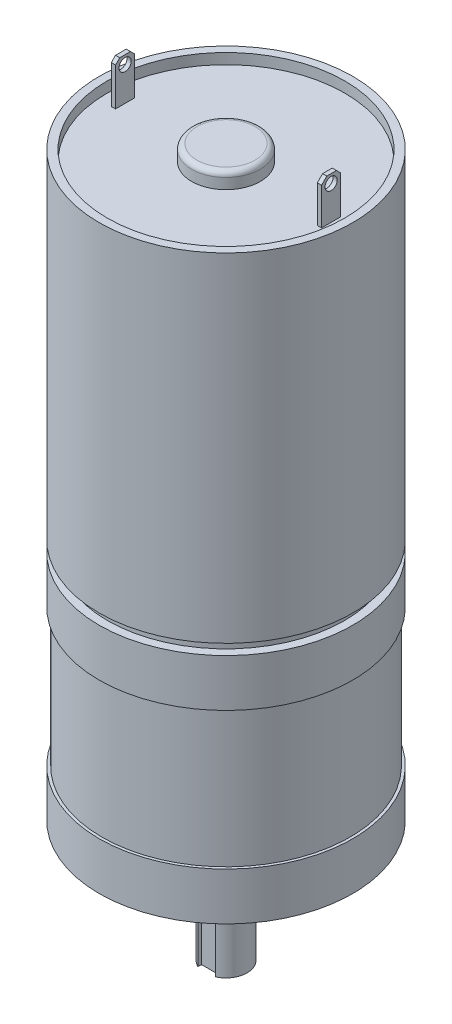
ISO-10303-21;
HEADER;
FILE_DESCRIPTION(('STEP AP214'),'2;1');
FILE_NAME('part.step','',(''),(''),'','','');
FILE_SCHEMA(('AUTOMOTIVE_DESIGN { 1 0 10303 214 1 1 1 1 }'));
ENDSEC;
DATA;
#1=APPLICATION_CONTEXT('core data for automotive mechanical design processes');
#2=APPLICATION_PROTOCOL_DEFINITION('international standard','automotive_design',2000,#1);
#3=PRODUCT_CONTEXT('',#1,'mechanical');
#4=PRODUCT('Part','Part','',(#3));
#5=PRODUCT_RELATED_PRODUCT_CATEGORY('part','',(#4));
#6=PRODUCT_DEFINITION_FORMATION('','',#4);
#7=PRODUCT_DEFINITION_CONTEXT('part definition',#1,'design');
#8=PRODUCT_DEFINITION('design','',#6,#7);
#9=PRODUCT_DEFINITION_SHAPE('','',#8);
#10=(LENGTH_UNIT() NAMED_UNIT(*) SI_UNIT(.MILLI.,.METRE.));
#11=(NAMED_UNIT(*) PLANE_ANGLE_UNIT() SI_UNIT($,.RADIAN.));
#12=(NAMED_UNIT(*) SI_UNIT($,.STERADIAN.) SOLID_ANGLE_UNIT());
#13=UNCERTAINTY_MEASURE_WITH_UNIT(LENGTH_MEASURE(1.E-05),#10,'distance_accuracy_value','');
#14=(GEOMETRIC_REPRESENTATION_CONTEXT(3) GLOBAL_UNCERTAINTY_ASSIGNED_CONTEXT((#13)) GLOBAL_UNIT_ASSIGNED_CONTEXT((#10,
#11,#12)) REPRESENTATION_CONTEXT('',''));
#15=CARTESIAN_POINT('',(0.,0.,0.));
#16=DIRECTION('',(0.,0.,1.));
#17=DIRECTION('',(1.,0.,0.));
#18=AXIS2_PLACEMENT_3D('',#15,#16,#17);
#19=CARTESIAN_POINT('',(0.,26.5,0.));
#20=DIRECTION('',(0.,1.,0.));
#21=DIRECTION('',(0.,0.,1.));
#22=AXIS2_PLACEMENT_3D('',#19,#20,#21);
#23=PLANE('',#22);
#24=DIRECTION('',(1.,0.,0.));
#25=VECTOR('',#24,1.);
#26=CARTESIAN_POINT('',(-9.55183129721211,26.5,-0.906839554497037));
#27=LINE('',#26,#25);
#28=CARTESIAN_POINT('',(-9.95096319405384,26.5,-0.906839554497037));
#29=VERTEX_POINT('',#28);
#30=CARTESIAN_POINT('',(-9.55183129721211,26.5,-0.906839554497037));
#31=VERTEX_POINT('',#30);
#32=EDGE_CURVE('E153',#29,#31,#27,.T.);
#33=ORIENTED_EDGE('',*,*,#32,.T.);
#34=DIRECTION('',(0.,0.,1.));
#35=VECTOR('',#34,1.);
#36=CARTESIAN_POINT('',(-9.55183129721211,26.5,0.906839554497037));
#37=LINE('',#36,#35);
#38=CARTESIAN_POINT('',(-9.55183129721211,26.5,0.906839554497037));
#39=VERTEX_POINT('',#38);
#40=EDGE_CURVE('E166',#31,#39,#37,.T.);
#41=ORIENTED_EDGE('',*,*,#40,.T.);
#42=DIRECTION('',(-1.,0.,0.));
#43=VECTOR('',#42,1.);
#44=CARTESIAN_POINT('',(-9.55183129721211,26.5,0.906839554497037));
#45=LINE('',#44,#43);
#46=CARTESIAN_POINT('',(-9.95096319405384,26.5,0.906839554497037));
#47=VERTEX_POINT('',#46);
#48=EDGE_CURVE('E175',#39,#47,#45,.T.);
#49=ORIENTED_EDGE('',*,*,#48,.T.);
#50=DIRECTION('',(0.,0.,-1.));
#51=VECTOR('',#50,1.);
#52=CARTESIAN_POINT('',(-9.95096319405384,26.5,-0.906839554497037));
#53=LINE('',#52,#51);
#54=EDGE_CURVE('E169',#47,#29,#53,.T.);
#55=ORIENTED_EDGE('',*,*,#54,.T.);
#56=EDGE_LOOP('',(#33,#41,#49,#55));
#57=FACE_BOUND('',#56,.T.);
#58=CARTESIAN_POINT('',(0.,26.5,0.));
#59=DIRECTION('',(0.,1.,0.));
#60=DIRECTION('',(0.,0.,1.));
#61=AXIS2_PLACEMENT_3D('',#58,#59,#60);
#62=CIRCLE('',#61,3.25);
#63=CARTESIAN_POINT('',(0.,26.5,3.25));
#64=VERTEX_POINT('',#63);
#65=EDGE_CURVE('E217',#64,#64,#62,.T.);
#66=ORIENTED_EDGE('',*,*,#65,.F.);
#67=EDGE_LOOP('',(#66));
#68=FACE_BOUND('',#67,.T.);
#69=CARTESIAN_POINT('',(0.,26.5,0.));
#70=DIRECTION('',(0.,1.,0.));
#71=DIRECTION('',(0.,0.,1.));
#72=AXIS2_PLACEMENT_3D('',#69,#70,#71);
#73=CIRCLE('',#72,11.2453658485005);
#74=CARTESIAN_POINT('',(0.,26.5,11.2453658485005));
#75=VERTEX_POINT('',#74);
#76=EDGE_CURVE('E283',#75,#75,#73,.T.);
#77=ORIENTED_EDGE('',*,*,#76,.T.);
#78=EDGE_LOOP('',(#77));
#79=FACE_BOUND('',#78,.T.);
#80=DIRECTION('',(0.,0.,1.));
#81=VECTOR('',#80,1.);
#82=CARTESIAN_POINT('',(9.55183129721211,26.5,0.906839554497037));
#83=LINE('',#82,#81);
#84=CARTESIAN_POINT('',(9.55183129721211,26.5,-0.906839554497037));
#85=VERTEX_POINT('',#84);
#86=CARTESIAN_POINT('',(9.55183129721211,26.5,0.906839554497037));
#87=VERTEX_POINT('',#86);
#88=EDGE_CURVE('E202',#85,#87,#83,.T.);
#89=ORIENTED_EDGE('',*,*,#88,.F.);
#90=DIRECTION('',(-1.,0.,0.));
#91=VECTOR('',#90,1.);
#92=CARTESIAN_POINT('',(9.55183129721211,26.5,-0.906839554497037));
#93=LINE('',#92,#91);
#94=CARTESIAN_POINT('',(9.95096319405384,26.5,-0.906839554497037));
#95=VERTEX_POINT('',#94);
#96=EDGE_CURVE('E192',#95,#85,#93,.T.);
#97=ORIENTED_EDGE('',*,*,#96,.F.);
#98=DIRECTION('',(0.,0.,-1.));
#99=VECTOR('',#98,1.);
#100=CARTESIAN_POINT('',(9.95096319405384,26.5,-0.906839554497037));
#101=LINE('',#100,#99);
#102=CARTESIAN_POINT('',(9.95096319405384,26.5,0.906839554497037));
#103=VERTEX_POINT('',#102);
#104=EDGE_CURVE('E197',#103,#95,#101,.T.);
#105=ORIENTED_EDGE('',*,*,#104,.F.);
#106=DIRECTION('',(1.,0.,0.));
#107=VECTOR('',#106,1.);
#108=CARTESIAN_POINT('',(9.55183129721211,26.5,0.906839554497037));
#109=LINE('',#108,#107);
#110=EDGE_CURVE('E205',#87,#103,#109,.T.);
#111=ORIENTED_EDGE('',*,*,#110,.F.);
#112=EDGE_LOOP('',(#89,#97,#105,#111));
#113=FACE_BOUND('',#112,.T.);
#114=ADVANCED_FACE('F36',(#57,#68,#79,#113),#23,.T.);
#115=CARTESIAN_POINT('',(0.,27.5,0.));
#116=DIRECTION('',(0.,-1.,0.));
#117=DIRECTION('',(0.,0.,-1.));
#118=AXIS2_PLACEMENT_3D('',#115,#116,#117);
#119=CYLINDRICAL_SURFACE('',#118,12.);
#120=CARTESIAN_POINT('',(0.,-5.5,0.));
#121=DIRECTION('',(0.,-1.,0.));
#122=DIRECTION('',(0.,0.,-1.));
#123=AXIS2_PLACEMENT_3D('',#120,#121,#122);
#124=CIRCLE('',#123,12.);
#125=CARTESIAN_POINT('',(0.,-5.5,-12.));
#126=VERTEX_POINT('',#125);
#127=EDGE_CURVE('E274',#126,#126,#124,.T.);
#128=ORIENTED_EDGE('',*,*,#127,.T.);
#129=EDGE_LOOP('',(#128));
#130=FACE_BOUND('',#129,.T.);
#131=CARTESIAN_POINT('',(0.,-10.,0.));
#132=DIRECTION('',(0.,-1.,0.));
#133=DIRECTION('',(0.,0.,-1.));
#134=AXIS2_PLACEMENT_3D('',#131,#132,#133);
#135=CIRCLE('',#134,12.);
#136=CARTESIAN_POINT('',(0.,-10.,-12.));
#137=VERTEX_POINT('',#136);
#138=EDGE_CURVE('E265',#137,#137,#135,.T.);
#139=ORIENTED_EDGE('',*,*,#138,.F.);
#140=EDGE_LOOP('',(#139));
#141=FACE_BOUND('',#140,.T.);
#142=ADVANCED_FACE('F361',(#130,#141),#119,.T.);
#143=CARTESIAN_POINT('',(0.,27.5,0.));
#144=DIRECTION('',(0.,1.,0.));
#145=DIRECTION('',(0.,0.,1.));
#146=AXIS2_PLACEMENT_3D('',#143,#144,#145);
#147=CIRCLE('',#146,12.);
#148=CARTESIAN_POINT('',(0.,27.5,12.));
#149=VERTEX_POINT('',#148);
#150=EDGE_CURVE('E258',#149,#149,#147,.T.);
#151=ORIENTED_EDGE('',*,*,#150,.F.);
#152=EDGE_LOOP('',(#151));
#153=FACE_BOUND('',#152,.T.);
#154=CARTESIAN_POINT('',(0.,-4.5,0.));
#155=DIRECTION('',(0.,-1.,0.));
#156=DIRECTION('',(0.,0.,-1.));
#157=AXIS2_PLACEMENT_3D('',#154,#155,#156);
#158=CIRCLE('',#157,12.);
#159=CARTESIAN_POINT('',(0.,-4.5,-12.));
#160=VERTEX_POINT('',#159);
#161=EDGE_CURVE('E277',#160,#160,#158,.T.);
#162=ORIENTED_EDGE('',*,*,#161,.F.);
#163=EDGE_LOOP('',(#162));
#164=FACE_BOUND('',#163,.T.);
#165=ADVANCED_FACE('F366',(#153,#164),#119,.T.);
#166=CARTESIAN_POINT('',(0.,27.5,0.));
#167=DIRECTION('',(0.,1.,0.));
#168=DIRECTION('',(0.,0.,1.));
#169=AXIS2_PLACEMENT_3D('',#166,#167,#168);
#170=PLANE('',#169);
#171=CARTESIAN_POINT('',(0.,27.5,0.));
#172=DIRECTION('',(0.,1.,0.));
#173=DIRECTION('',(0.,0.,1.));
#174=AXIS2_PLACEMENT_3D('',#171,#172,#173);
#175=CIRCLE('',#174,11.2453658485005);
#176=CARTESIAN_POINT('',(0.,27.5,11.2453658485005));
#177=VERTEX_POINT('',#176);
#178=EDGE_CURVE('E280',#177,#177,#175,.T.);
#179=ORIENTED_EDGE('',*,*,#178,.F.);
#180=EDGE_LOOP('',(#179));
#181=FACE_BOUND('',#180,.T.);
#182=ORIENTED_EDGE('',*,*,#150,.T.);
#183=EDGE_LOOP('',(#182));
#184=FACE_BOUND('',#183,.T.);
#185=ADVANCED_FACE('F378',(#181,#184),#170,.T.);
#186=CARTESIAN_POINT('',(0.,26.5,0.));
#187=DIRECTION('',(0.,1.,0.));
#188=DIRECTION('',(0.,0.,1.));
#189=AXIS2_PLACEMENT_3D('',#186,#187,#188);
#190=CYLINDRICAL_SURFACE('',#189,11.2453658485005);
#191=ORIENTED_EDGE('',*,*,#76,.F.);
#192=EDGE_LOOP('',(#191));
#193=FACE_BOUND('',#192,.T.);
#194=ORIENTED_EDGE('',*,*,#178,.T.);
#195=EDGE_LOOP('',(#194));
#196=FACE_BOUND('',#195,.T.);
#197=ADVANCED_FACE('F374',(#193,#196),#190,.F.);
#198=CARTESIAN_POINT('',(0.,-4.5,0.));
#199=DIRECTION('',(0.,-1.,0.));
#200=DIRECTION('',(0.,0.,-1.));
#201=AXIS2_PLACEMENT_3D('',#198,#199,#200);
#202=PLANE('',#201);
#203=CARTESIAN_POINT('',(0.,-4.5,0.));
#204=DIRECTION('',(0.,-1.,0.));
#205=DIRECTION('',(0.,0.,-1.));
#206=AXIS2_PLACEMENT_3D('',#203,#204,#205);
#207=CIRCLE('',#206,11.226713735415);
#208=CARTESIAN_POINT('',(0.,-4.5,-11.226713735415));
#209=VERTEX_POINT('',#208);
#210=EDGE_CURVE('E271',#209,#209,#207,.T.);
#211=ORIENTED_EDGE('',*,*,#210,.F.);
#212=EDGE_LOOP('',(#211));
#213=FACE_BOUND('',#212,.T.);
#214=ORIENTED_EDGE('',*,*,#161,.T.);
#215=EDGE_LOOP('',(#214));
#216=FACE_BOUND('',#215,.T.);
#217=ADVANCED_FACE('F377',(#213,#216),#202,.T.);
#218=CARTESIAN_POINT('',(0.,-5.5,0.));
#219=DIRECTION('',(0.,-1.,0.));
#220=DIRECTION('',(0.,0.,-1.));
#221=AXIS2_PLACEMENT_3D('',#218,#219,#220);
#222=PLANE('',#221);
#223=CARTESIAN_POINT('',(0.,-5.5,0.));
#224=DIRECTION('',(0.,-1.,0.));
#225=DIRECTION('',(0.,0.,-1.));
#226=AXIS2_PLACEMENT_3D('',#223,#224,#225);
#227=CIRCLE('',#226,11.226713735415);
#228=CARTESIAN_POINT('',(0.,-5.5,-11.226713735415));
#229=VERTEX_POINT('',#228);
#230=EDGE_CURVE('E268',#229,#229,#227,.T.);
#231=ORIENTED_EDGE('',*,*,#230,.T.);
#232=EDGE_LOOP('',(#231));
#233=FACE_BOUND('',#232,.T.);
#234=ORIENTED_EDGE('',*,*,#127,.F.);
#235=EDGE_LOOP('',(#234));
#236=FACE_BOUND('',#235,.T.);
#237=ADVANCED_FACE('F372',(#233,#236),#222,.F.);
#238=CARTESIAN_POINT('',(0.,-4.5,0.));
#239=DIRECTION('',(0.,-1.,0.));
#240=DIRECTION('',(0.,0.,-1.));
#241=AXIS2_PLACEMENT_3D('',#238,#239,#240);
#242=CYLINDRICAL_SURFACE('',#241,11.226713735415);
#243=ORIENTED_EDGE('',*,*,#210,.T.);
#244=EDGE_LOOP('',(#243));
#245=FACE_BOUND('',#244,.T.);
#246=ORIENTED_EDGE('',*,*,#230,.F.);
#247=EDGE_LOOP('',(#246));
#248=FACE_BOUND('',#247,.T.);
#249=ADVANCED_FACE('F497',(#245,#248),#242,.T.);
#250=CARTESIAN_POINT('',(0.,-10.,0.));
#251=DIRECTION('',(0.,-1.,0.));
#252=DIRECTION('',(0.,0.,-1.));
#253=AXIS2_PLACEMENT_3D('',#250,#251,#252);
#254=PLANE('',#253);
#255=CARTESIAN_POINT('',(0.,-10.,0.));
#256=DIRECTION('',(0.,-1.,0.));
#257=DIRECTION('',(0.,0.,-1.));
#258=AXIS2_PLACEMENT_3D('',#255,#256,#257);
#259=CIRCLE('',#258,11.7423883014442);
#260=CARTESIAN_POINT('',(0.,-10.,-11.7423883014442));
#261=VERTEX_POINT('',#260);
#262=EDGE_CURVE('E259',#261,#261,#259,.T.);
#263=ORIENTED_EDGE('',*,*,#262,.F.);
#264=EDGE_LOOP('',(#263));
#265=FACE_BOUND('',#264,.T.);
#266=ORIENTED_EDGE('',*,*,#138,.T.);
#267=EDGE_LOOP('',(#266));
#268=FACE_BOUND('',#267,.T.);
#269=ADVANCED_FACE('F494',(#265,#268),#254,.T.);
#270=CARTESIAN_POINT('',(0.,-23.,0.));
#271=DIRECTION('',(0.,-1.,0.));
#272=DIRECTION('',(0.,0.,-1.));
#273=AXIS2_PLACEMENT_3D('',#270,#271,#272);
#274=PLANE('',#273);
#275=CARTESIAN_POINT('',(0.,-23.,0.));
#276=DIRECTION('',(0.,-1.,0.));
#277=DIRECTION('',(0.,0.,-1.));
#278=AXIS2_PLACEMENT_3D('',#275,#276,#277);
#279=CIRCLE('',#278,11.7423883014442);
#280=CARTESIAN_POINT('',(0.,-23.,-11.7423883014442));
#281=VERTEX_POINT('',#280);
#282=EDGE_CURVE('E255',#281,#281,#279,.T.);
#283=ORIENTED_EDGE('',*,*,#282,.T.);
#284=EDGE_LOOP('',(#283));
#285=FACE_BOUND('',#284,.T.);
#286=CARTESIAN_POINT('',(0.,-23.,0.));
#287=DIRECTION('',(0.,-1.,0.));
#288=DIRECTION('',(0.,0.,-1.));
#289=AXIS2_PLACEMENT_3D('',#286,#287,#288);
#290=CIRCLE('',#289,12.);
#291=CARTESIAN_POINT('',(0.,-23.,-12.));
#292=VERTEX_POINT('',#291);
#293=EDGE_CURVE('E262',#292,#292,#290,.T.);
#294=ORIENTED_EDGE('',*,*,#293,.F.);
#295=EDGE_LOOP('',(#294));
#296=FACE_BOUND('',#295,.T.);
#297=ADVANCED_FACE('F492',(#285,#296),#274,.F.);
#298=CARTESIAN_POINT('',(0.,-10.,0.));
#299=DIRECTION('',(0.,-1.,0.));
#300=DIRECTION('',(0.,0.,-1.));
#301=AXIS2_PLACEMENT_3D('',#298,#299,#300);
#302=CYLINDRICAL_SURFACE('',#301,11.7423883014442);
#303=ORIENTED_EDGE('',*,*,#262,.T.);
#304=EDGE_LOOP('',(#303));
#305=FACE_BOUND('',#304,.T.);
#306=ORIENTED_EDGE('',*,*,#282,.F.);
#307=EDGE_LOOP('',(#306));
#308=FACE_BOUND('',#307,.T.);
#309=ADVANCED_FACE('F385',(#305,#308),#302,.T.);
#310=CARTESIAN_POINT('',(0.,-27.5,0.));
#311=DIRECTION('',(0.,1.,0.));
#312=DIRECTION('',(0.,0.,1.));
#313=AXIS2_PLACEMENT_3D('',#310,#311,#312);
#314=PLANE('',#313);
#315=CARTESIAN_POINT('',(0.,-27.5,0.));
#316=DIRECTION('',(0.,-1.,0.));
#317=DIRECTION('',(0.,0.,-1.));
#318=AXIS2_PLACEMENT_3D('',#315,#316,#317);
#319=CIRCLE('',#318,3.5);
#320=CARTESIAN_POINT('',(0.,-27.5,-3.5));
#321=VERTEX_POINT('',#320);
#322=EDGE_CURVE('E252',#321,#321,#319,.T.);
#323=ORIENTED_EDGE('',*,*,#322,.F.);
#324=EDGE_LOOP('',(#323));
#325=FACE_BOUND('',#324,.T.);
#326=CARTESIAN_POINT('',(0.,-27.5,0.));
#327=DIRECTION('',(0.,1.,0.));
#328=DIRECTION('',(0.,0.,1.));
#329=AXIS2_PLACEMENT_3D('',#326,#327,#328);
#330=CIRCLE('',#329,12.);
#331=CARTESIAN_POINT('',(0.,-27.5,12.));
#332=VERTEX_POINT('',#331);
#333=EDGE_CURVE('E286',#332,#332,#330,.T.);
#334=ORIENTED_EDGE('',*,*,#333,.F.);
#335=EDGE_LOOP('',(#334));
#336=FACE_BOUND('',#335,.T.);
#337=ADVANCED_FACE('F383',(#325,#336),#314,.F.);
#338=ORIENTED_EDGE('',*,*,#293,.T.);
#339=EDGE_LOOP('',(#338));
#340=FACE_BOUND('',#339,.T.);
#341=ORIENTED_EDGE('',*,*,#333,.T.);
#342=EDGE_LOOP('',(#341));
#343=FACE_BOUND('',#342,.T.);
#344=ADVANCED_FACE('F369',(#340,#343),#119,.T.);
#345=CARTESIAN_POINT('',(0.,-30.,0.));
#346=DIRECTION('',(0.,1.,0.));
#347=DIRECTION('',(0.,0.,1.));
#348=AXIS2_PLACEMENT_3D('',#345,#346,#347);
#349=CYLINDRICAL_SURFACE('',#348,3.5);
#350=CARTESIAN_POINT('',(0.,-30.,0.));
#351=DIRECTION('',(0.,-1.,0.));
#352=DIRECTION('',(0.,0.,-1.));
#353=AXIS2_PLACEMENT_3D('',#350,#351,#352);
#354=CIRCLE('',#353,3.5);
#355=CARTESIAN_POINT('',(0.,-30.,-3.5));
#356=VERTEX_POINT('',#355);
#357=EDGE_CURVE('E247',#356,#356,#354,.T.);
#358=ORIENTED_EDGE('',*,*,#357,.F.);
#359=EDGE_LOOP('',(#358));
#360=FACE_BOUND('',#359,.T.);
#361=ORIENTED_EDGE('',*,*,#322,.T.);
#362=EDGE_LOOP('',(#361));
#363=FACE_BOUND('',#362,.T.);
#364=ADVANCED_FACE('F389',(#360,#363),#349,.T.);
#365=CARTESIAN_POINT('',(0.,-30.,0.));
#366=DIRECTION('',(0.,-1.,0.));
#367=DIRECTION('',(0.,0.,-1.));
#368=AXIS2_PLACEMENT_3D('',#365,#366,#367);
#369=PLANE('',#368);
#370=CARTESIAN_POINT('',(0.,-30.,0.));
#371=DIRECTION('',(0.,-1.,0.));
#372=DIRECTION('',(0.,0.,-1.));
#373=AXIS2_PLACEMENT_3D('',#370,#371,#372);
#374=CIRCLE('',#373,2.);
#375=CARTESIAN_POINT('',(0.,-30.,-2.));
#376=VERTEX_POINT('',#375);
#377=EDGE_CURVE('E248',#376,#376,#374,.T.);
#378=ORIENTED_EDGE('',*,*,#377,.F.);
#379=EDGE_LOOP('',(#378));
#380=FACE_BOUND('',#379,.T.);
#381=ORIENTED_EDGE('',*,*,#357,.T.);
#382=EDGE_LOOP('',(#381));
#383=FACE_BOUND('',#382,.T.);
#384=ADVANCED_FACE('F482',(#380,#383),#369,.T.);
#385=CARTESIAN_POINT('',(0.,-39.,0.));
#386=DIRECTION('',(0.,1.,0.));
#387=DIRECTION('',(0.,0.,1.));
#388=AXIS2_PLACEMENT_3D('',#385,#386,#387);
#389=CYLINDRICAL_SURFACE('',#388,2.);
#390=CARTESIAN_POINT('',(0.,-39.,0.));
#391=DIRECTION('',(0.,-1.,0.));
#392=DIRECTION('',(0.,0.,-1.));
#393=AXIS2_PLACEMENT_3D('',#390,#391,#392);
#394=CIRCLE('',#393,2.);
#395=CARTESIAN_POINT('',(-0.84169059918239,-39.,1.81426484705183));
#396=VERTEX_POINT('',#395);
#397=CARTESIAN_POINT('',(0.84169059918239,-39.,1.81426484705183));
#398=VERTEX_POINT('',#397);
#399=EDGE_CURVE('E244',#396,#398,#394,.T.);
#400=ORIENTED_EDGE('',*,*,#399,.F.);
#401=DIRECTION('',(0.,1.,0.));
#402=VECTOR('',#401,1.);
#403=CARTESIAN_POINT('',(-0.84169059918239,-39.,1.81426484705183));
#404=LINE('',#403,#402);
#405=CARTESIAN_POINT('',(-0.84169059918239,-31.,1.81426484705183));
#406=VERTEX_POINT('',#405);
#407=EDGE_CURVE('E241',#396,#406,#404,.T.);
#408=ORIENTED_EDGE('',*,*,#407,.T.);
#409=CARTESIAN_POINT('',(0.,-31.,0.));
#410=DIRECTION('',(0.,-1.,0.));
#411=DIRECTION('',(0.,0.,-1.));
#412=AXIS2_PLACEMENT_3D('',#409,#410,#411);
#413=CIRCLE('',#412,2.);
#414=CARTESIAN_POINT('',(0.84169059918239,-31.,1.81426484705183));
#415=VERTEX_POINT('',#414);
#416=EDGE_CURVE('E294',#415,#406,#413,.T.);
#417=ORIENTED_EDGE('',*,*,#416,.F.);
#418=DIRECTION('',(0.,1.,0.));
#419=VECTOR('',#418,1.);
#420=CARTESIAN_POINT('',(0.84169059918239,-39.,1.81426484705183));
#421=LINE('',#420,#419);
#422=EDGE_CURVE('E236',#415,#398,#421,.F.);
#423=ORIENTED_EDGE('',*,*,#422,.T.);
#424=EDGE_LOOP('',(#400,#408,#417,#423));
#425=FACE_BOUND('',#424,.T.);
#426=ORIENTED_EDGE('',*,*,#377,.T.);
#427=EDGE_LOOP('',(#426));
#428=FACE_BOUND('',#427,.T.);
#429=ADVANCED_FACE('F478',(#425,#428),#389,.T.);
#430=CARTESIAN_POINT('',(0.,-39.,0.));
#431=DIRECTION('',(0.,-1.,0.));
#432=DIRECTION('',(0.,0.,-1.));
#433=AXIS2_PLACEMENT_3D('',#430,#431,#432);
#434=PLANE('',#433);
#435=DIRECTION('',(0.,0.,-1.));
#436=VECTOR('',#435,1.);
#437=CARTESIAN_POINT('',(-0.84169059918239,-39.,0.));
#438=LINE('',#437,#436);
#439=CARTESIAN_POINT('',(-0.84169059918239,-39.,1.47815551840979));
#440=VERTEX_POINT('',#439);
#441=EDGE_CURVE('E251',#396,#440,#438,.T.);
#442=ORIENTED_EDGE('',*,*,#441,.F.);
#443=ORIENTED_EDGE('',*,*,#399,.T.);
#444=DIRECTION('',(0.,0.,1.));
#445=VECTOR('',#444,1.);
#446=CARTESIAN_POINT('',(0.84169059918239,-39.,1.65927550681691));
#447=LINE('',#446,#445);
#448=CARTESIAN_POINT('',(0.84169059918239,-39.,1.47815551840979));
#449=VERTEX_POINT('',#448);
#450=EDGE_CURVE('E220',#449,#398,#447,.T.);
#451=ORIENTED_EDGE('',*,*,#450,.F.);
#452=DIRECTION('',(1.,0.,0.));
#453=VECTOR('',#452,1.);
#454=CARTESIAN_POINT('',(-0.84169059918239,-39.,1.47815551840979));
#455=LINE('',#454,#453);
#456=EDGE_CURVE('E225',#440,#449,#455,.T.);
#457=ORIENTED_EDGE('',*,*,#456,.F.);
#458=EDGE_LOOP('',(#442,#443,#451,#457));
#459=FACE_BOUND('',#458,.T.);
#460=ADVANCED_FACE('F464',(#459),#434,.T.);
#461=CARTESIAN_POINT('',(0.,-31.,0.));
#462=DIRECTION('',(0.,-1.,0.));
#463=DIRECTION('',(0.,0.,-1.));
#464=AXIS2_PLACEMENT_3D('',#461,#462,#463);
#465=PLANE('',#464);
#466=ORIENTED_EDGE('',*,*,#416,.T.);
#467=DIRECTION('',(0.,0.,-1.));
#468=VECTOR('',#467,1.);
#469=CARTESIAN_POINT('',(-0.84169059918239,-31.,1.65927550681691));
#470=LINE('',#469,#468);
#471=CARTESIAN_POINT('',(-0.84169059918239,-31.,1.47815551840979));
#472=VERTEX_POINT('',#471);
#473=EDGE_CURVE('E224',#406,#472,#470,.T.);
#474=ORIENTED_EDGE('',*,*,#473,.T.);
#475=DIRECTION('',(1.,0.,0.));
#476=VECTOR('',#475,1.);
#477=CARTESIAN_POINT('',(-0.84169059918239,-31.,1.47815551840979));
#478=LINE('',#477,#476);
#479=CARTESIAN_POINT('',(0.84169059918239,-31.,1.47815551840979));
#480=VERTEX_POINT('',#479);
#481=EDGE_CURVE('E227',#472,#480,#478,.T.);
#482=ORIENTED_EDGE('',*,*,#481,.T.);
#483=DIRECTION('',(0.,0.,1.));
#484=VECTOR('',#483,1.);
#485=CARTESIAN_POINT('',(0.84169059918239,-31.,1.47815551840979));
#486=LINE('',#485,#484);
#487=EDGE_CURVE('E221',#480,#415,#486,.T.);
#488=ORIENTED_EDGE('',*,*,#487,.T.);
#489=EDGE_LOOP('',(#466,#474,#482,#488));
#490=FACE_BOUND('',#489,.T.);
#491=ADVANCED_FACE('F460',(#490),#465,.T.);
#492=CARTESIAN_POINT('',(-0.84169059918239,-31.,1.65927550681691));
#493=DIRECTION('',(-1.,0.,0.));
#494=DIRECTION('',(0.,0.,1.));
#495=AXIS2_PLACEMENT_3D('',#492,#493,#494);
#496=PLANE('',#495);
#497=ORIENTED_EDGE('',*,*,#441,.T.);
#498=DIRECTION('',(0.,-1.,0.));
#499=VECTOR('',#498,1.);
#500=CARTESIAN_POINT('',(-0.84169059918239,-31.,1.47815551840979));
#501=LINE('',#500,#499);
#502=EDGE_CURVE('E230',#472,#440,#501,.T.);
#503=ORIENTED_EDGE('',*,*,#502,.F.);
#504=ORIENTED_EDGE('',*,*,#473,.F.);
#505=ORIENTED_EDGE('',*,*,#407,.F.);
#506=EDGE_LOOP('',(#497,#503,#504,#505));
#507=FACE_BOUND('',#506,.T.);
#508=ADVANCED_FACE('F463',(#507),#496,.F.);
#509=CARTESIAN_POINT('',(0.84169059918239,-31.,1.65927550681691));
#510=DIRECTION('',(1.,0.,0.));
#511=DIRECTION('',(0.,0.,-1.));
#512=AXIS2_PLACEMENT_3D('',#509,#510,#511);
#513=PLANE('',#512);
#514=ORIENTED_EDGE('',*,*,#487,.F.);
#515=DIRECTION('',(0.,-1.,0.));
#516=VECTOR('',#515,1.);
#517=CARTESIAN_POINT('',(0.84169059918239,-31.,1.47815551840979));
#518=LINE('',#517,#516);
#519=EDGE_CURVE('E233',#480,#449,#518,.T.);
#520=ORIENTED_EDGE('',*,*,#519,.T.);
#521=ORIENTED_EDGE('',*,*,#450,.T.);
#522=ORIENTED_EDGE('',*,*,#422,.F.);
#523=EDGE_LOOP('',(#514,#520,#521,#522));
#524=FACE_BOUND('',#523,.T.);
#525=ADVANCED_FACE('F468',(#524),#513,.F.);
#526=CARTESIAN_POINT('',(-0.84169059918239,-31.,1.47815551840979));
#527=DIRECTION('',(0.,0.,-1.));
#528=DIRECTION('',(-1.,0.,0.));
#529=AXIS2_PLACEMENT_3D('',#526,#527,#528);
#530=PLANE('',#529);
#531=ORIENTED_EDGE('',*,*,#456,.T.);
#532=ORIENTED_EDGE('',*,*,#519,.F.);
#533=ORIENTED_EDGE('',*,*,#481,.F.);
#534=ORIENTED_EDGE('',*,*,#502,.T.);
#535=EDGE_LOOP('',(#531,#532,#533,#534));
#536=FACE_BOUND('',#535,.T.);
#537=ADVANCED_FACE('F458',(#536),#530,.F.);
#538=CARTESIAN_POINT('',(0.,28.,0.));
#539=DIRECTION('',(0.,-1.,0.));
#540=DIRECTION('',(0.,0.,-1.));
#541=AXIS2_PLACEMENT_3D('',#538,#539,#540);
#542=CYLINDRICAL_SURFACE('',#541,3.25);
#543=CARTESIAN_POINT('',(0.,27.5,0.));
#544=DIRECTION('',(0.,1.,0.));
#545=DIRECTION('',(0.,0.,1.));
#546=AXIS2_PLACEMENT_3D('',#543,#544,#545);
#547=CIRCLE('',#546,3.25);
#548=CARTESIAN_POINT('',(0.,27.5,3.25));
#549=VERTEX_POINT('',#548);
#550=EDGE_CURVE('E299',#549,#549,#547,.F.);
#551=ORIENTED_EDGE('',*,*,#550,.T.);
#552=EDGE_LOOP('',(#551));
#553=FACE_BOUND('',#552,.T.);
#554=ORIENTED_EDGE('',*,*,#65,.T.);
#555=EDGE_LOOP('',(#554));
#556=FACE_BOUND('',#555,.T.);
#557=ADVANCED_FACE('F454',(#553,#556),#542,.T.);
#558=CARTESIAN_POINT('',(0.,28.,0.));
#559=DIRECTION('',(0.,1.,0.));
#560=DIRECTION('',(0.,0.,1.));
#561=AXIS2_PLACEMENT_3D('',#558,#559,#560);
#562=PLANE('',#561);
#563=CARTESIAN_POINT('',(0.,28.,0.));
#564=DIRECTION('',(0.,1.,0.));
#565=DIRECTION('',(0.,0.,1.));
#566=AXIS2_PLACEMENT_3D('',#563,#564,#565);
#567=CIRCLE('',#566,2.75);
#568=CARTESIAN_POINT('',(0.,28.,2.75));
#569=VERTEX_POINT('',#568);
#570=EDGE_CURVE('E296',#569,#569,#567,.T.);
#571=ORIENTED_EDGE('',*,*,#570,.T.);
#572=EDGE_LOOP('',(#571));
#573=FACE_BOUND('',#572,.T.);
#574=ADVANCED_FACE('F395',(#573),#562,.T.);
#575=CARTESIAN_POINT('',(0.,27.5,0.));
#576=DIRECTION('',(0.,1.,0.));
#577=DIRECTION('',(0.,0.,1.));
#578=AXIS2_PLACEMENT_3D('',#575,#576,#577);
#579=TOROIDAL_SURFACE('',#578,2.75,0.5);
#580=ORIENTED_EDGE('',*,*,#550,.F.);
#581=EDGE_LOOP('',(#580));
#582=FACE_BOUND('',#581,.T.);
#583=ORIENTED_EDGE('',*,*,#570,.F.);
#584=EDGE_LOOP('',(#583));
#585=FACE_BOUND('',#584,.T.);
#586=ADVANCED_FACE('F391',(#582,#585),#579,.T.);
#587=CARTESIAN_POINT('',(9.55183129721211,30.5,-0.906839554497037));
#588=DIRECTION('',(0.,0.,1.));
#589=DIRECTION('',(1.,0.,0.));
#590=AXIS2_PLACEMENT_3D('',#587,#588,#589);
#591=PLANE('',#590);
#592=DIRECTION('',(0.,-1.,0.));
#593=VECTOR('',#592,1.);
#594=CARTESIAN_POINT('',(9.55183129721211,30.5,-0.906839554497037));
#595=LINE('',#594,#593);
#596=CARTESIAN_POINT('',(9.55183129721211,30.1,-0.906839554497037));
#597=VERTEX_POINT('',#596);
#598=EDGE_CURVE('E215',#597,#85,#595,.T.);
#599=ORIENTED_EDGE('',*,*,#598,.F.);
#600=DIRECTION('',(1.,0.,0.));
#601=VECTOR('',#600,1.);
#602=CARTESIAN_POINT('',(9.55183129721211,30.1,-0.906839554497037));
#603=LINE('',#602,#601);
#604=CARTESIAN_POINT('',(9.95096319405384,30.1,-0.906839554497037));
#605=VERTEX_POINT('',#604);
#606=EDGE_CURVE('E307',#597,#605,#603,.T.);
#607=ORIENTED_EDGE('',*,*,#606,.T.);
#608=DIRECTION('',(0.,-1.,0.));
#609=VECTOR('',#608,1.);
#610=CARTESIAN_POINT('',(9.95096319405384,30.5,-0.906839554497037));
#611=LINE('',#610,#609);
#612=EDGE_CURVE('E199',#605,#95,#611,.T.);
#613=ORIENTED_EDGE('',*,*,#612,.T.);
#614=ORIENTED_EDGE('',*,*,#96,.T.);
#615=EDGE_LOOP('',(#599,#607,#613,#614));
#616=FACE_BOUND('',#615,.T.);
#617=ADVANCED_FACE('F394',(#616),#591,.F.);
#618=CARTESIAN_POINT('',(9.55183129721211,30.5,0.906839554497037));
#619=DIRECTION('',(1.,0.,0.));
#620=DIRECTION('',(0.,0.,-1.));
#621=AXIS2_PLACEMENT_3D('',#618,#619,#620);
#622=PLANE('',#621);
#623=CARTESIAN_POINT('',(9.55183129721211,29.6821239928812,0.));
#624=DIRECTION('',(1.,0.,0.));
#625=DIRECTION('',(0.,0.,-1.));
#626=AXIS2_PLACEMENT_3D('',#623,#624,#625);
#627=CIRCLE('',#626,0.578483289254739);
#628=CARTESIAN_POINT('',(9.55183129721211,29.6821239928812,-0.578483289254739));
#629=VERTEX_POINT('',#628);
#630=EDGE_CURVE('E189',#629,#629,#627,.T.);
#631=ORIENTED_EDGE('',*,*,#630,.T.);
#632=EDGE_LOOP('',(#631));
#633=FACE_BOUND('',#632,.T.);
#634=DIRECTION('',(0.,-1.,0.));
#635=VECTOR('',#634,1.);
#636=CARTESIAN_POINT('',(9.55183129721211,30.5,0.906839554497037));
#637=LINE('',#636,#635);
#638=CARTESIAN_POINT('',(9.55183129721211,30.,0.906839554497037));
#639=VERTEX_POINT('',#638);
#640=EDGE_CURVE('E213',#639,#87,#637,.T.);
#641=ORIENTED_EDGE('',*,*,#640,.F.);
#642=DIRECTION('',(0.,-0.707106781186543,0.707106781186552));
#643=VECTOR('',#642,1.);
#644=CARTESIAN_POINT('',(9.55183129721211,30.5,0.406839554497037));
#645=LINE('',#644,#643);
#646=CARTESIAN_POINT('',(9.55183129721211,30.5,0.406839554497037));
#647=VERTEX_POINT('',#646);
#648=EDGE_CURVE('E319',#639,#647,#645,.F.);
#649=ORIENTED_EDGE('',*,*,#648,.T.);
#650=DIRECTION('',(0.,0.,1.));
#651=VECTOR('',#650,1.);
#652=CARTESIAN_POINT('',(9.55183129721211,30.5,0.906839554497037));
#653=LINE('',#652,#651);
#654=CARTESIAN_POINT('',(9.55183129721211,30.5,-0.506839554497032));
#655=VERTEX_POINT('',#654);
#656=EDGE_CURVE('E193',#655,#647,#653,.T.);
#657=ORIENTED_EDGE('',*,*,#656,.F.);
#658=DIRECTION('',(0.,0.707106781186541,0.707106781186554));
#659=VECTOR('',#658,1.);
#660=CARTESIAN_POINT('',(9.55183129721211,30.5,-0.506839554497032));
#661=LINE('',#660,#659);
#662=EDGE_CURVE('E305',#655,#597,#661,.F.);
#663=ORIENTED_EDGE('',*,*,#662,.T.);
#664=ORIENTED_EDGE('',*,*,#598,.T.);
#665=ORIENTED_EDGE('',*,*,#88,.T.);
#666=EDGE_LOOP('',(#641,#649,#657,#663,#664,#665));
#667=FACE_BOUND('',#666,.T.);
#668=ADVANCED_FACE('F417',(#633,#667),#622,.F.);
#669=CARTESIAN_POINT('',(9.55183129721211,30.5,0.906839554497037));
#670=DIRECTION('',(0.,0.,-1.));
#671=DIRECTION('',(-1.,0.,0.));
#672=AXIS2_PLACEMENT_3D('',#669,#670,#671);
#673=PLANE('',#672);
#674=DIRECTION('',(0.,-1.,0.));
#675=VECTOR('',#674,1.);
#676=CARTESIAN_POINT('',(9.95096319405384,30.5,0.906839554497037));
#677=LINE('',#676,#675);
#678=CARTESIAN_POINT('',(9.95096319405384,30.,0.906839554497037));
#679=VERTEX_POINT('',#678);
#680=EDGE_CURVE('E211',#679,#103,#677,.T.);
#681=ORIENTED_EDGE('',*,*,#680,.F.);
#682=DIRECTION('',(-1.,0.,0.));
#683=VECTOR('',#682,1.);
#684=CARTESIAN_POINT('',(9.55183129721211,30.,0.906839554497037));
#685=LINE('',#684,#683);
#686=EDGE_CURVE('E317',#679,#639,#685,.T.);
#687=ORIENTED_EDGE('',*,*,#686,.T.);
#688=ORIENTED_EDGE('',*,*,#640,.T.);
#689=ORIENTED_EDGE('',*,*,#110,.T.);
#690=EDGE_LOOP('',(#681,#687,#688,#689));
#691=FACE_BOUND('',#690,.T.);
#692=ADVANCED_FACE('F433',(#691),#673,.F.);
#693=CARTESIAN_POINT('',(9.95096319405384,30.5,-0.906839554497037));
#694=DIRECTION('',(-1.,0.,0.));
#695=DIRECTION('',(0.,0.,1.));
#696=AXIS2_PLACEMENT_3D('',#693,#694,#695);
#697=PLANE('',#696);
#698=CARTESIAN_POINT('',(9.95096319405384,29.6821239928812,0.));
#699=DIRECTION('',(1.,0.,0.));
#700=DIRECTION('',(0.,0.,-1.));
#701=AXIS2_PLACEMENT_3D('',#698,#699,#700);
#702=CIRCLE('',#701,0.578483289254739);
#703=CARTESIAN_POINT('',(9.95096319405384,29.6821239928812,-0.578483289254739));
#704=VERTEX_POINT('',#703);
#705=EDGE_CURVE('E186',#704,#704,#702,.T.);
#706=ORIENTED_EDGE('',*,*,#705,.F.);
#707=EDGE_LOOP('',(#706));
#708=FACE_BOUND('',#707,.T.);
#709=DIRECTION('',(0.,0.,-1.));
#710=VECTOR('',#709,1.);
#711=CARTESIAN_POINT('',(9.95096319405384,30.5,-0.906839554497037));
#712=LINE('',#711,#710);
#713=CARTESIAN_POINT('',(9.95096319405384,30.5,0.406839554497037));
#714=VERTEX_POINT('',#713);
#715=CARTESIAN_POINT('',(9.95096319405384,30.5,-0.506839554497032));
#716=VERTEX_POINT('',#715);
#717=EDGE_CURVE('E196',#714,#716,#712,.T.);
#718=ORIENTED_EDGE('',*,*,#717,.F.);
#719=DIRECTION('',(0.,0.707106781186543,-0.707106781186552));
#720=VECTOR('',#719,1.);
#721=CARTESIAN_POINT('',(9.95096319405384,30.5,0.406839554497037));
#722=LINE('',#721,#720);
#723=EDGE_CURVE('E315',#714,#679,#722,.F.);
#724=ORIENTED_EDGE('',*,*,#723,.T.);
#725=ORIENTED_EDGE('',*,*,#680,.T.);
#726=ORIENTED_EDGE('',*,*,#104,.T.);
#727=ORIENTED_EDGE('',*,*,#612,.F.);
#728=DIRECTION('',(0.,-0.707106781186541,-0.707106781186554));
#729=VECTOR('',#728,1.);
#730=CARTESIAN_POINT('',(9.95096319405384,30.5,-0.506839554497032));
#731=LINE('',#730,#729);
#732=EDGE_CURVE('E309',#605,#716,#731,.F.);
#733=ORIENTED_EDGE('',*,*,#732,.T.);
#734=EDGE_LOOP('',(#718,#724,#725,#726,#727,#733));
#735=FACE_BOUND('',#734,.T.);
#736=ADVANCED_FACE('F435',(#708,#735),#697,.F.);
#737=CARTESIAN_POINT('',(0.,30.5,0.));
#738=DIRECTION('',(0.,-1.,0.));
#739=DIRECTION('',(0.,0.,-1.));
#740=AXIS2_PLACEMENT_3D('',#737,#738,#739);
#741=PLANE('',#740);
#742=ORIENTED_EDGE('',*,*,#656,.T.);
#743=DIRECTION('',(1.,0.,0.));
#744=VECTOR('',#743,1.);
#745=CARTESIAN_POINT('',(0.,30.5,0.406839554497037));
#746=LINE('',#745,#744);
#747=EDGE_CURVE('E312',#647,#714,#746,.T.);
#748=ORIENTED_EDGE('',*,*,#747,.T.);
#749=ORIENTED_EDGE('',*,*,#717,.T.);
#750=DIRECTION('',(-1.,0.,0.));
#751=VECTOR('',#750,1.);
#752=CARTESIAN_POINT('',(0.,30.5,-0.506839554497032));
#753=LINE('',#752,#751);
#754=EDGE_CURVE('E302',#716,#655,#753,.T.);
#755=ORIENTED_EDGE('',*,*,#754,.T.);
#756=EDGE_LOOP('',(#742,#748,#749,#755));
#757=FACE_BOUND('',#756,.T.);
#758=ADVANCED_FACE('F401',(#757),#741,.F.);
#759=CARTESIAN_POINT('',(0.,30.5,-0.506839554497032));
#760=DIRECTION('',(0.,-0.707106781186554,0.707106781186541));
#761=DIRECTION('',(-1.,0.,0.));
#762=AXIS2_PLACEMENT_3D('',#759,#760,#761);
#763=PLANE('',#762);
#764=ORIENTED_EDGE('',*,*,#732,.F.);
#765=ORIENTED_EDGE('',*,*,#606,.F.);
#766=ORIENTED_EDGE('',*,*,#662,.F.);
#767=ORIENTED_EDGE('',*,*,#754,.F.);
#768=EDGE_LOOP('',(#764,#765,#766,#767));
#769=FACE_BOUND('',#768,.T.);
#770=ADVANCED_FACE('F397',(#769),#763,.F.);
#771=CARTESIAN_POINT('',(0.,30.5,0.406839554497037));
#772=DIRECTION('',(0.,-0.707106781186552,-0.707106781186543));
#773=DIRECTION('',(1.,0.,0.));
#774=AXIS2_PLACEMENT_3D('',#771,#772,#773);
#775=PLANE('',#774);
#776=ORIENTED_EDGE('',*,*,#648,.F.);
#777=ORIENTED_EDGE('',*,*,#686,.F.);
#778=ORIENTED_EDGE('',*,*,#723,.F.);
#779=ORIENTED_EDGE('',*,*,#747,.F.);
#780=EDGE_LOOP('',(#776,#777,#778,#779));
#781=FACE_BOUND('',#780,.T.);
#782=ADVANCED_FACE('F400',(#781),#775,.F.);
#783=CARTESIAN_POINT('',(5.95096319405384,29.6821239928812,0.));
#784=DIRECTION('',(1.,0.,0.));
#785=DIRECTION('',(0.,0.,-1.));
#786=AXIS2_PLACEMENT_3D('',#783,#784,#785);
#787=CYLINDRICAL_SURFACE('',#786,0.578483289254739);
#788=ORIENTED_EDGE('',*,*,#705,.T.);
#789=EDGE_LOOP('',(#788));
#790=FACE_BOUND('',#789,.T.);
#791=ORIENTED_EDGE('',*,*,#630,.F.);
#792=EDGE_LOOP('',(#791));
#793=FACE_BOUND('',#792,.T.);
#794=ADVANCED_FACE('F404',(#790,#793),#787,.F.);
#795=CARTESIAN_POINT('',(-9.55183129721211,30.5,-0.906839554497037));
#796=DIRECTION('',(0.,0.,-1.));
#797=DIRECTION('',(-1.,0.,0.));
#798=AXIS2_PLACEMENT_3D('',#795,#796,#797);
#799=PLANE('',#798);
#800=DIRECTION('',(0.,-1.,0.));
#801=VECTOR('',#800,1.);
#802=CARTESIAN_POINT('',(-9.95096319405384,30.5,-0.906839554497037));
#803=LINE('',#802,#801);
#804=CARTESIAN_POINT('',(-9.95096319405384,30.1,-0.906839554497037));
#805=VERTEX_POINT('',#804);
#806=EDGE_CURVE('E184',#805,#29,#803,.T.);
#807=ORIENTED_EDGE('',*,*,#806,.F.);
#808=DIRECTION('',(1.,0.,0.));
#809=VECTOR('',#808,1.);
#810=CARTESIAN_POINT('',(-9.55183129721211,30.1,-0.906839554497037));
#811=LINE('',#810,#809);
#812=CARTESIAN_POINT('',(-9.55183129721211,30.1,-0.906839554497037));
#813=VERTEX_POINT('',#812);
#814=EDGE_CURVE('E155',#805,#813,#811,.T.);
#815=ORIENTED_EDGE('',*,*,#814,.T.);
#816=DIRECTION('',(0.,-1.,0.));
#817=VECTOR('',#816,1.);
#818=CARTESIAN_POINT('',(-9.55183129721211,30.5,-0.906839554497037));
#819=LINE('',#818,#817);
#820=EDGE_CURVE('E149',#813,#31,#819,.T.);
#821=ORIENTED_EDGE('',*,*,#820,.T.);
#822=ORIENTED_EDGE('',*,*,#32,.F.);
#823=EDGE_LOOP('',(#807,#815,#821,#822));
#824=FACE_BOUND('',#823,.T.);
#825=ADVANCED_FACE('F152',(#824),#799,.T.);
#826=CARTESIAN_POINT('',(-9.95096319405384,30.5,-0.906839554497037));
#827=DIRECTION('',(-1.,0.,0.));
#828=DIRECTION('',(0.,0.,1.));
#829=AXIS2_PLACEMENT_3D('',#826,#827,#828);
#830=PLANE('',#829);
#831=CARTESIAN_POINT('',(-9.95096319405384,29.6821239928812,0.));
#832=DIRECTION('',(1.,0.,0.));
#833=DIRECTION('',(0.,0.,-1.));
#834=AXIS2_PLACEMENT_3D('',#831,#832,#833);
#835=CIRCLE('',#834,0.578483289254739);
#836=CARTESIAN_POINT('',(-9.95096319405384,29.6821239928812,-0.578483289254739));
#837=VERTEX_POINT('',#836);
#838=EDGE_CURVE('E323',#837,#837,#835,.T.);
#839=ORIENTED_EDGE('',*,*,#838,.T.);
#840=EDGE_LOOP('',(#839));
#841=FACE_BOUND('',#840,.T.);
#842=DIRECTION('',(0.,-1.,0.));
#843=VECTOR('',#842,1.);
#844=CARTESIAN_POINT('',(-9.95096319405384,30.5,0.906839554497037));
#845=LINE('',#844,#843);
#846=CARTESIAN_POINT('',(-9.95096319405384,30.1,0.906839554497037));
#847=VERTEX_POINT('',#846);
#848=EDGE_CURVE('E182',#847,#47,#845,.T.);
#849=ORIENTED_EDGE('',*,*,#848,.F.);
#850=DIRECTION('',(0.,0.707106781186541,-0.707106781186554));
#851=VECTOR('',#850,1.);
#852=CARTESIAN_POINT('',(-9.95096319405384,31.206839554497,-0.200000000000014));
#853=LINE('',#852,#851);
#854=CARTESIAN_POINT('',(-9.95096319405384,30.5,0.506839554497032));
#855=VERTEX_POINT('',#854);
#856=EDGE_CURVE('E58',#847,#855,#853,.T.);
#857=ORIENTED_EDGE('',*,*,#856,.T.);
#858=DIRECTION('',(0.,0.,-1.));
#859=VECTOR('',#858,1.);
#860=CARTESIAN_POINT('',(-9.95096319405384,30.5,-0.906839554497037));
#861=LINE('',#860,#859);
#862=CARTESIAN_POINT('',(-9.95096319405384,30.5,-0.506839554497032));
#863=VERTEX_POINT('',#862);
#864=EDGE_CURVE('E174',#855,#863,#861,.T.);
#865=ORIENTED_EDGE('',*,*,#864,.T.);
#866=DIRECTION('',(0.,-0.707106781186541,-0.707106781186554));
#867=VECTOR('',#866,1.);
#868=CARTESIAN_POINT('',(-9.95096319405384,30.3,-0.706839554497038));
#869=LINE('',#868,#867);
#870=EDGE_CURVE('E330',#863,#805,#869,.T.);
#871=ORIENTED_EDGE('',*,*,#870,.T.);
#872=ORIENTED_EDGE('',*,*,#806,.T.);
#873=ORIENTED_EDGE('',*,*,#54,.F.);
#874=EDGE_LOOP('',(#849,#857,#865,#871,#872,#873));
#875=FACE_BOUND('',#874,.T.);
#876=ADVANCED_FACE('F340',(#841,#875),#830,.T.);
#877=CARTESIAN_POINT('',(-9.55183129721211,30.5,0.906839554497037));
#878=DIRECTION('',(0.,0.,1.));
#879=DIRECTION('',(1.,0.,0.));
#880=AXIS2_PLACEMENT_3D('',#877,#878,#879);
#881=PLANE('',#880);
#882=DIRECTION('',(0.,-1.,0.));
#883=VECTOR('',#882,1.);
#884=CARTESIAN_POINT('',(-9.55183129721211,30.5,0.906839554497037));
#885=LINE('',#884,#883);
#886=CARTESIAN_POINT('',(-9.55183129721211,30.1,0.906839554497037));
#887=VERTEX_POINT('',#886);
#888=EDGE_CURVE('E158',#887,#39,#885,.T.);
#889=ORIENTED_EDGE('',*,*,#888,.F.);
#890=DIRECTION('',(-1.,0.,0.));
#891=VECTOR('',#890,1.);
#892=CARTESIAN_POINT('',(-9.95096319405384,30.1,0.906839554497037));
#893=LINE('',#892,#891);
#894=EDGE_CURVE('E332',#887,#847,#893,.T.);
#895=ORIENTED_EDGE('',*,*,#894,.T.);
#896=ORIENTED_EDGE('',*,*,#848,.T.);
#897=ORIENTED_EDGE('',*,*,#48,.F.);
#898=EDGE_LOOP('',(#889,#895,#896,#897));
#899=FACE_BOUND('',#898,.T.);
#900=ADVANCED_FACE('F337',(#899),#881,.T.);
#901=CARTESIAN_POINT('',(-9.55183129721211,30.5,0.906839554497037));
#902=DIRECTION('',(1.,0.,0.));
#903=DIRECTION('',(0.,0.,-1.));
#904=AXIS2_PLACEMENT_3D('',#901,#902,#903);
#905=PLANE('',#904);
#906=CARTESIAN_POINT('',(-9.55183129721211,29.6821239928812,0.));
#907=DIRECTION('',(1.,0.,0.));
#908=DIRECTION('',(0.,0.,-1.));
#909=AXIS2_PLACEMENT_3D('',#906,#907,#908);
#910=CIRCLE('',#909,0.578483289254739);
#911=CARTESIAN_POINT('',(-9.55183129721211,29.6821239928812,-0.578483289254739));
#912=VERTEX_POINT('',#911);
#913=EDGE_CURVE('E170',#912,#912,#910,.F.);
#914=ORIENTED_EDGE('',*,*,#913,.T.);
#915=EDGE_LOOP('',(#914));
#916=FACE_BOUND('',#915,.T.);
#917=DIRECTION('',(0.,0.,1.));
#918=VECTOR('',#917,1.);
#919=CARTESIAN_POINT('',(-9.55183129721211,30.5,0.906839554497037));
#920=LINE('',#919,#918);
#921=CARTESIAN_POINT('',(-9.55183129721211,30.5,-0.506839554497032));
#922=VERTEX_POINT('',#921);
#923=CARTESIAN_POINT('',(-9.55183129721211,30.5,0.506839554497032));
#924=VERTEX_POINT('',#923);
#925=EDGE_CURVE('E159',#922,#924,#920,.T.);
#926=ORIENTED_EDGE('',*,*,#925,.T.);
#927=DIRECTION('',(0.,-0.707106781186541,0.707106781186554));
#928=VECTOR('',#927,1.);
#929=CARTESIAN_POINT('',(-9.55183129721211,30.3,0.706839554497038));
#930=LINE('',#929,#928);
#931=EDGE_CURVE('E11',#924,#887,#930,.T.);
#932=ORIENTED_EDGE('',*,*,#931,.T.);
#933=ORIENTED_EDGE('',*,*,#888,.T.);
#934=ORIENTED_EDGE('',*,*,#40,.F.);
#935=ORIENTED_EDGE('',*,*,#820,.F.);
#936=DIRECTION('',(0.,0.707106781186541,0.707106781186554));
#937=VECTOR('',#936,1.);
#938=CARTESIAN_POINT('',(-9.55183129721211,31.206839554497,0.200000000000014));
#939=LINE('',#938,#937);
#940=EDGE_CURVE('E325',#813,#922,#939,.T.);
#941=ORIENTED_EDGE('',*,*,#940,.T.);
#942=EDGE_LOOP('',(#926,#932,#933,#934,#935,#941));
#943=FACE_BOUND('',#942,.T.);
#944=ADVANCED_FACE('F172',(#916,#943),#905,.T.);
#945=CARTESIAN_POINT('',(0.,30.5,0.));
#946=DIRECTION('',(0.,-1.,0.));
#947=DIRECTION('',(0.,0.,-1.));
#948=AXIS2_PLACEMENT_3D('',#945,#946,#947);
#949=PLANE('',#948);
#950=ORIENTED_EDGE('',*,*,#864,.F.);
#951=DIRECTION('',(1.,0.,0.));
#952=VECTOR('',#951,1.);
#953=CARTESIAN_POINT('',(-9.55183129721211,30.5,0.506839554497032));
#954=LINE('',#953,#952);
#955=EDGE_CURVE('E44',#855,#924,#954,.T.);
#956=ORIENTED_EDGE('',*,*,#955,.T.);
#957=ORIENTED_EDGE('',*,*,#925,.F.);
#958=DIRECTION('',(-1.,0.,0.));
#959=VECTOR('',#958,1.);
#960=CARTESIAN_POINT('',(-9.95096319405384,30.5,-0.506839554497032));
#961=LINE('',#960,#959);
#962=EDGE_CURVE('E327',#922,#863,#961,.T.);
#963=ORIENTED_EDGE('',*,*,#962,.T.);
#964=EDGE_LOOP('',(#950,#956,#957,#963));
#965=FACE_BOUND('',#964,.T.);
#966=ADVANCED_FACE('F350',(#965),#949,.F.);
#967=CARTESIAN_POINT('',(-5.95096319405384,29.6821239928812,0.));
#968=DIRECTION('',(-1.,0.,0.));
#969=DIRECTION('',(0.,0.,1.));
#970=AXIS2_PLACEMENT_3D('',#967,#968,#969);
#971=CYLINDRICAL_SURFACE('',#970,0.578483289254739);
#972=ORIENTED_EDGE('',*,*,#913,.F.);
#973=EDGE_LOOP('',(#972));
#974=FACE_BOUND('',#973,.T.);
#975=ORIENTED_EDGE('',*,*,#838,.F.);
#976=EDGE_LOOP('',(#975));
#977=FACE_BOUND('',#976,.T.);
#978=ADVANCED_FACE('F347',(#974,#977),#971,.F.);
#979=CARTESIAN_POINT('',(-9.55183129721211,30.1,-0.906839554497037));
#980=DIRECTION('',(0.,0.707106781186554,-0.707106781186541));
#981=DIRECTION('',(-1.,0.,0.));
#982=AXIS2_PLACEMENT_3D('',#979,#980,#981);
#983=PLANE('',#982);
#984=ORIENTED_EDGE('',*,*,#870,.F.);
#985=ORIENTED_EDGE('',*,*,#962,.F.);
#986=ORIENTED_EDGE('',*,*,#940,.F.);
#987=ORIENTED_EDGE('',*,*,#814,.F.);
#988=EDGE_LOOP('',(#984,#985,#986,#987));
#989=FACE_BOUND('',#988,.T.);
#990=ADVANCED_FACE('F349',(#989),#983,.T.);
#991=CARTESIAN_POINT('',(-9.55183129721211,30.1,0.906839554497037));
#992=DIRECTION('',(0.,0.707106781186554,0.707106781186541));
#993=DIRECTION('',(1.,0.,0.));
#994=AXIS2_PLACEMENT_3D('',#991,#992,#993);
#995=PLANE('',#994);
#996=ORIENTED_EDGE('',*,*,#931,.F.);
#997=ORIENTED_EDGE('',*,*,#955,.F.);
#998=ORIENTED_EDGE('',*,*,#856,.F.);
#999=ORIENTED_EDGE('',*,*,#894,.F.);
#1000=EDGE_LOOP('',(#996,#997,#998,#999));
#1001=FACE_BOUND('',#1000,.T.);
#1002=ADVANCED_FACE('F38',(#1001),#995,.T.);
#1003=CLOSED_SHELL('',(#114,#142,#165,#185,#197,#217,#237,#249,#269,#297,#309,#337,#344,#364,
#384,#429,#460,#491,#508,#525,#537,#557,#574,#586,#617,#668,#692,#736,#758,#770,#782,#794,#825,
#876,#900,#944,#966,#978,#990,#1002));
#1004=MANIFOLD_SOLID_BREP('B2',#1003);
#1005=ADVANCED_BREP_SHAPE_REPRESENTATION('',(#18,#1004),#14);
#1006=SHAPE_DEFINITION_REPRESENTATION(#9,#1005);
ENDSEC;
END-ISO-10303-21;
